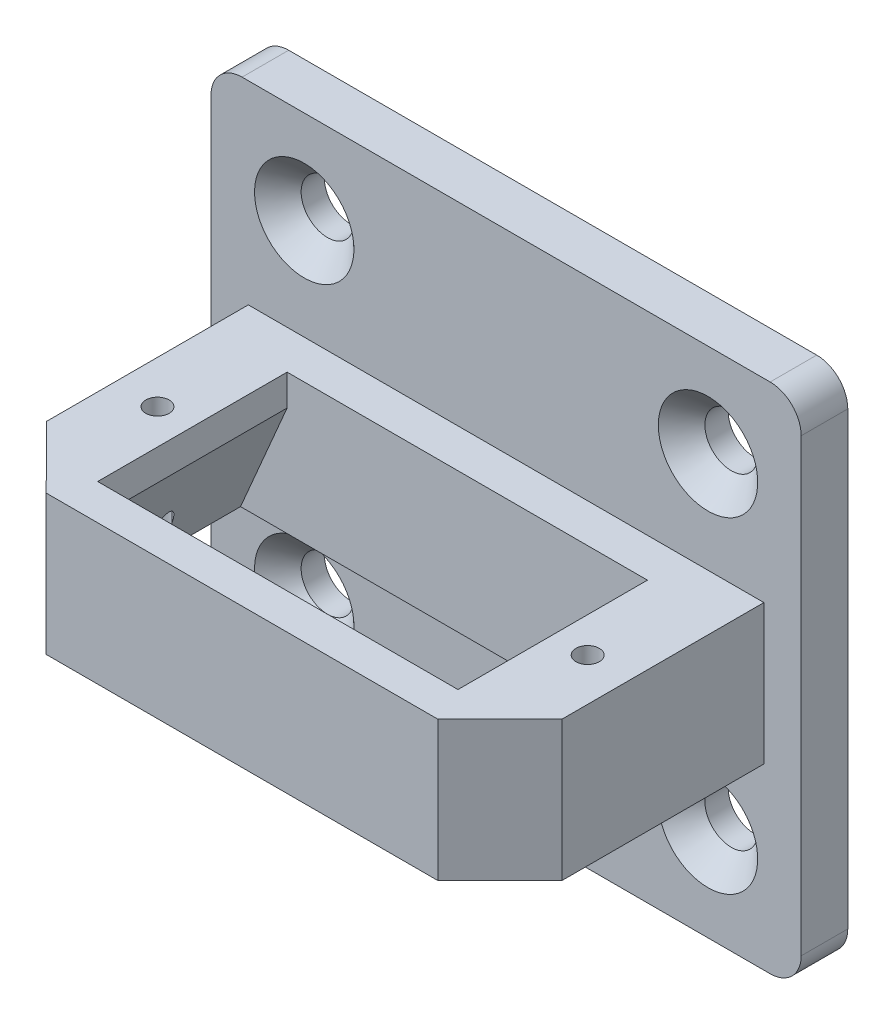
ISO-10303-21;
HEADER;
FILE_DESCRIPTION(('STEP AP214'),'2;1');
FILE_NAME('part.step','',(''),(''),'','','');
FILE_SCHEMA(('AUTOMOTIVE_DESIGN { 1 0 10303 214 1 1 1 1 }'));
ENDSEC;
DATA;
#1=APPLICATION_CONTEXT('core data for automotive mechanical design processes');
#2=APPLICATION_PROTOCOL_DEFINITION('international standard','automotive_design',2000,#1);
#3=PRODUCT_CONTEXT('',#1,'mechanical');
#4=PRODUCT('Part','Part','',(#3));
#5=PRODUCT_RELATED_PRODUCT_CATEGORY('part','',(#4));
#6=PRODUCT_DEFINITION_FORMATION('','',#4);
#7=PRODUCT_DEFINITION_CONTEXT('part definition',#1,'design');
#8=PRODUCT_DEFINITION('design','',#6,#7);
#9=PRODUCT_DEFINITION_SHAPE('','',#8);
#10=(LENGTH_UNIT() NAMED_UNIT(*) SI_UNIT(.MILLI.,.METRE.));
#11=(NAMED_UNIT(*) PLANE_ANGLE_UNIT() SI_UNIT($,.RADIAN.));
#12=(NAMED_UNIT(*) SI_UNIT($,.STERADIAN.) SOLID_ANGLE_UNIT());
#13=UNCERTAINTY_MEASURE_WITH_UNIT(LENGTH_MEASURE(1.E-05),#10,'distance_accuracy_value','');
#14=(GEOMETRIC_REPRESENTATION_CONTEXT(3) GLOBAL_UNCERTAINTY_ASSIGNED_CONTEXT((#13)) GLOBAL_UNIT_ASSIGNED_CONTEXT((#10,
#11,#12)) REPRESENTATION_CONTEXT('',''));
#15=CARTESIAN_POINT('',(0.,0.,0.));
#16=DIRECTION('',(0.,0.,1.));
#17=DIRECTION('',(1.,0.,0.));
#18=AXIS2_PLACEMENT_3D('',#15,#16,#17);
#19=CARTESIAN_POINT('',(0.,0.,3.));
#20=DIRECTION('',(0.,0.,-1.));
#21=DIRECTION('',(-1.,0.,0.));
#22=AXIS2_PLACEMENT_3D('',#19,#20,#21);
#23=PLANE('',#22);
#24=CARTESIAN_POINT('',(-13.,10.5,3.));
#25=DIRECTION('',(0.,0.,-1.));
#26=DIRECTION('',(-1.,0.,0.));
#27=AXIS2_PLACEMENT_3D('',#24,#25,#26);
#28=CIRCLE('',#27,3.20000000000002);
#29=CARTESIAN_POINT('',(-16.2,10.5,3.));
#30=VERTEX_POINT('',#29);
#31=EDGE_CURVE('E422',#30,#30,#28,.T.);
#32=ORIENTED_EDGE('',*,*,#31,.T.);
#33=EDGE_LOOP('',(#32));
#34=FACE_BOUND('',#33,.T.);
#35=CARTESIAN_POINT('',(-13.,-10.5,3.));
#36=DIRECTION('',(0.,0.,-1.));
#37=DIRECTION('',(-1.,0.,0.));
#38=AXIS2_PLACEMENT_3D('',#35,#36,#37);
#39=CIRCLE('',#38,3.20000000000002);
#40=CARTESIAN_POINT('',(-16.2,-10.5,3.));
#41=VERTEX_POINT('',#40);
#42=EDGE_CURVE('E418',#41,#41,#39,.T.);
#43=ORIENTED_EDGE('',*,*,#42,.T.);
#44=EDGE_LOOP('',(#43));
#45=FACE_BOUND('',#44,.T.);
#46=CARTESIAN_POINT('',(13.,-10.5,3.));
#47=DIRECTION('',(0.,0.,-1.));
#48=DIRECTION('',(-1.,0.,0.));
#49=AXIS2_PLACEMENT_3D('',#46,#47,#48);
#50=CIRCLE('',#49,3.20000000000002);
#51=CARTESIAN_POINT('',(9.79999999999998,-10.5,3.));
#52=VERTEX_POINT('',#51);
#53=EDGE_CURVE('E414',#52,#52,#50,.T.);
#54=ORIENTED_EDGE('',*,*,#53,.T.);
#55=EDGE_LOOP('',(#54));
#56=FACE_BOUND('',#55,.T.);
#57=CARTESIAN_POINT('',(13.,10.5,3.));
#58=DIRECTION('',(0.,0.,-1.));
#59=DIRECTION('',(-1.,0.,0.));
#60=AXIS2_PLACEMENT_3D('',#57,#58,#59);
#61=CIRCLE('',#60,3.20000000000002);
#62=CARTESIAN_POINT('',(9.79999999999999,10.5,3.));
#63=VERTEX_POINT('',#62);
#64=EDGE_CURVE('E410',#63,#63,#61,.T.);
#65=ORIENTED_EDGE('',*,*,#64,.T.);
#66=EDGE_LOOP('',(#65));
#67=FACE_BOUND('',#66,.T.);
#68=DIRECTION('',(1.,0.,0.));
#69=VECTOR('',#68,1.);
#70=CARTESIAN_POINT('',(-16.6,4.,3.));
#71=LINE('',#70,#69);
#72=CARTESIAN_POINT('',(-16.6,4.,3.));
#73=VERTEX_POINT('',#72);
#74=CARTESIAN_POINT('',(16.6,4.,3.));
#75=VERTEX_POINT('',#74);
#76=EDGE_CURVE('E259',#73,#75,#71,.T.);
#77=ORIENTED_EDGE('',*,*,#76,.T.);
#78=DIRECTION('',(0.,-1.,0.));
#79=VECTOR('',#78,1.);
#80=CARTESIAN_POINT('',(16.6,4.,3.));
#81=LINE('',#80,#79);
#82=CARTESIAN_POINT('',(16.6,-5.,3.));
#83=VERTEX_POINT('',#82);
#84=EDGE_CURVE('E287',#75,#83,#81,.T.);
#85=ORIENTED_EDGE('',*,*,#84,.T.);
#86=DIRECTION('',(1.,0.,0.));
#87=VECTOR('',#86,1.);
#88=CARTESIAN_POINT('',(-16.6,-5.,3.));
#89=LINE('',#88,#87);
#90=CARTESIAN_POINT('',(-16.6,-5.,3.));
#91=VERTEX_POINT('',#90);
#92=EDGE_CURVE('E207',#91,#83,#89,.T.);
#93=ORIENTED_EDGE('',*,*,#92,.F.);
#94=DIRECTION('',(0.,-1.,0.));
#95=VECTOR('',#94,1.);
#96=CARTESIAN_POINT('',(-16.6,4.,3.));
#97=LINE('',#96,#95);
#98=EDGE_CURVE('E288',#73,#91,#97,.T.);
#99=ORIENTED_EDGE('',*,*,#98,.F.);
#100=EDGE_LOOP('',(#77,#85,#93,#99));
#101=FACE_BOUND('',#100,.T.);
#102=DIRECTION('',(-1.,0.,0.));
#103=VECTOR('',#102,1.);
#104=CARTESIAN_POINT('',(-19.,16.5,3.));
#105=LINE('',#104,#103);
#106=CARTESIAN_POINT('',(17.,16.5,3.));
#107=VERTEX_POINT('',#106);
#108=CARTESIAN_POINT('',(-17.,16.5,3.));
#109=VERTEX_POINT('',#108);
#110=EDGE_CURVE('E327',#107,#109,#105,.T.);
#111=ORIENTED_EDGE('',*,*,#110,.T.);
#112=CARTESIAN_POINT('',(-17.,14.5,3.));
#113=DIRECTION('',(0.,0.,-1.));
#114=DIRECTION('',(-1.,0.,0.));
#115=AXIS2_PLACEMENT_3D('',#112,#113,#114);
#116=CIRCLE('',#115,2.);
#117=CARTESIAN_POINT('',(-19.,14.5,3.));
#118=VERTEX_POINT('',#117);
#119=EDGE_CURVE('E389',#109,#118,#116,.F.);
#120=ORIENTED_EDGE('',*,*,#119,.T.);
#121=DIRECTION('',(0.,-1.,0.));
#122=VECTOR('',#121,1.);
#123=CARTESIAN_POINT('',(-19.,-16.5,3.));
#124=LINE('',#123,#122);
#125=CARTESIAN_POINT('',(-19.,-14.5,3.));
#126=VERTEX_POINT('',#125);
#127=EDGE_CURVE('E332',#118,#126,#124,.T.);
#128=ORIENTED_EDGE('',*,*,#127,.T.);
#129=CARTESIAN_POINT('',(-17.,-14.5,3.));
#130=DIRECTION('',(0.,0.,-1.));
#131=DIRECTION('',(-1.,0.,0.));
#132=AXIS2_PLACEMENT_3D('',#129,#130,#131);
#133=CIRCLE('',#132,2.);
#134=CARTESIAN_POINT('',(-17.,-16.5,3.));
#135=VERTEX_POINT('',#134);
#136=EDGE_CURVE('E386',#126,#135,#133,.F.);
#137=ORIENTED_EDGE('',*,*,#136,.T.);
#138=DIRECTION('',(1.,0.,0.));
#139=VECTOR('',#138,1.);
#140=CARTESIAN_POINT('',(-19.,-16.5,3.));
#141=LINE('',#140,#139);
#142=CARTESIAN_POINT('',(17.,-16.5,3.));
#143=VERTEX_POINT('',#142);
#144=EDGE_CURVE('E336',#135,#143,#141,.T.);
#145=ORIENTED_EDGE('',*,*,#144,.T.);
#146=CARTESIAN_POINT('',(17.,-14.5,3.));
#147=DIRECTION('',(0.,0.,-1.));
#148=DIRECTION('',(-1.,0.,0.));
#149=AXIS2_PLACEMENT_3D('',#146,#147,#148);
#150=CIRCLE('',#149,2.);
#151=CARTESIAN_POINT('',(19.,-14.5,3.));
#152=VERTEX_POINT('',#151);
#153=EDGE_CURVE('E380',#143,#152,#150,.F.);
#154=ORIENTED_EDGE('',*,*,#153,.T.);
#155=DIRECTION('',(0.,1.,0.));
#156=VECTOR('',#155,1.);
#157=CARTESIAN_POINT('',(19.,-16.5,3.));
#158=LINE('',#157,#156);
#159=CARTESIAN_POINT('',(19.,14.5,3.));
#160=VERTEX_POINT('',#159);
#161=EDGE_CURVE('E323',#152,#160,#158,.T.);
#162=ORIENTED_EDGE('',*,*,#161,.T.);
#163=CARTESIAN_POINT('',(17.,14.5,3.));
#164=DIRECTION('',(0.,0.,-1.));
#165=DIRECTION('',(-1.,0.,0.));
#166=AXIS2_PLACEMENT_3D('',#163,#164,#165);
#167=CIRCLE('',#166,2.);
#168=EDGE_CURVE('E383',#160,#107,#167,.F.);
#169=ORIENTED_EDGE('',*,*,#168,.T.);
#170=EDGE_LOOP('',(#111,#120,#128,#137,#145,#154,#162,#169));
#171=FACE_BOUND('',#170,.T.);
#172=ADVANCED_FACE('F45',(#34,#45,#56,#67,#101,#171),#23,.F.);
#173=CARTESIAN_POINT('',(0.,0.,0.));
#174=DIRECTION('',(0.,0.,-1.));
#175=DIRECTION('',(-1.,0.,0.));
#176=AXIS2_PLACEMENT_3D('',#173,#174,#175);
#177=PLANE('',#176);
#178=CARTESIAN_POINT('',(13.,-10.5,0.));
#179=DIRECTION('',(0.,0.,1.));
#180=DIRECTION('',(1.,0.,0.));
#181=AXIS2_PLACEMENT_3D('',#178,#179,#180);
#182=CIRCLE('',#181,1.7);
#183=CARTESIAN_POINT('',(14.7,-10.5,0.));
#184=VERTEX_POINT('',#183);
#185=EDGE_CURVE('E310',#184,#184,#182,.T.);
#186=ORIENTED_EDGE('',*,*,#185,.T.);
#187=EDGE_LOOP('',(#186));
#188=FACE_BOUND('',#187,.T.);
#189=CARTESIAN_POINT('',(-13.,10.5,0.));
#190=DIRECTION('',(0.,0.,1.));
#191=DIRECTION('',(1.,0.,0.));
#192=AXIS2_PLACEMENT_3D('',#189,#190,#191);
#193=CIRCLE('',#192,1.7);
#194=CARTESIAN_POINT('',(-11.3,10.5,0.));
#195=VERTEX_POINT('',#194);
#196=EDGE_CURVE('E318',#195,#195,#193,.T.);
#197=ORIENTED_EDGE('',*,*,#196,.T.);
#198=EDGE_LOOP('',(#197));
#199=FACE_BOUND('',#198,.T.);
#200=DIRECTION('',(0.,-1.,0.));
#201=VECTOR('',#200,1.);
#202=CARTESIAN_POINT('',(-19.,-16.5,0.));
#203=LINE('',#202,#201);
#204=CARTESIAN_POINT('',(-19.,14.5,0.));
#205=VERTEX_POINT('',#204);
#206=CARTESIAN_POINT('',(-19.,-14.5,0.));
#207=VERTEX_POINT('',#206);
#208=EDGE_CURVE('E348',#205,#207,#203,.T.);
#209=ORIENTED_EDGE('',*,*,#208,.F.);
#210=CARTESIAN_POINT('',(-17.,14.5,0.));
#211=DIRECTION('',(0.,0.,-1.));
#212=DIRECTION('',(-1.,0.,0.));
#213=AXIS2_PLACEMENT_3D('',#210,#211,#212);
#214=CIRCLE('',#213,2.);
#215=CARTESIAN_POINT('',(-17.,16.5,0.));
#216=VERTEX_POINT('',#215);
#217=EDGE_CURVE('E370',#205,#216,#214,.T.);
#218=ORIENTED_EDGE('',*,*,#217,.T.);
#219=DIRECTION('',(-1.,0.,0.));
#220=VECTOR('',#219,1.);
#221=CARTESIAN_POINT('',(-19.,16.5,0.));
#222=LINE('',#221,#220);
#223=CARTESIAN_POINT('',(17.,16.5,0.));
#224=VERTEX_POINT('',#223);
#225=EDGE_CURVE('E344',#224,#216,#222,.T.);
#226=ORIENTED_EDGE('',*,*,#225,.F.);
#227=CARTESIAN_POINT('',(17.,14.5,0.));
#228=DIRECTION('',(0.,0.,-1.));
#229=DIRECTION('',(-1.,0.,0.));
#230=AXIS2_PLACEMENT_3D('',#227,#228,#229);
#231=CIRCLE('',#230,2.);
#232=CARTESIAN_POINT('',(19.,14.5,0.));
#233=VERTEX_POINT('',#232);
#234=EDGE_CURVE('E364',#224,#233,#231,.T.);
#235=ORIENTED_EDGE('',*,*,#234,.T.);
#236=DIRECTION('',(0.,1.,0.));
#237=VECTOR('',#236,1.);
#238=CARTESIAN_POINT('',(19.,-16.5,0.));
#239=LINE('',#238,#237);
#240=CARTESIAN_POINT('',(19.,-14.5,0.));
#241=VERTEX_POINT('',#240);
#242=EDGE_CURVE('E322',#241,#233,#239,.T.);
#243=ORIENTED_EDGE('',*,*,#242,.F.);
#244=CARTESIAN_POINT('',(17.,-14.5,0.));
#245=DIRECTION('',(0.,0.,-1.));
#246=DIRECTION('',(-1.,0.,0.));
#247=AXIS2_PLACEMENT_3D('',#244,#245,#246);
#248=CIRCLE('',#247,2.);
#249=CARTESIAN_POINT('',(17.,-16.5,0.));
#250=VERTEX_POINT('',#249);
#251=EDGE_CURVE('E361',#241,#250,#248,.T.);
#252=ORIENTED_EDGE('',*,*,#251,.T.);
#253=DIRECTION('',(1.,0.,0.));
#254=VECTOR('',#253,1.);
#255=CARTESIAN_POINT('',(-19.,-16.5,0.));
#256=LINE('',#255,#254);
#257=CARTESIAN_POINT('',(-17.,-16.5,0.));
#258=VERTEX_POINT('',#257);
#259=EDGE_CURVE('E328',#258,#250,#256,.T.);
#260=ORIENTED_EDGE('',*,*,#259,.F.);
#261=CARTESIAN_POINT('',(-17.,-14.5,0.));
#262=DIRECTION('',(0.,0.,-1.));
#263=DIRECTION('',(-1.,0.,0.));
#264=AXIS2_PLACEMENT_3D('',#261,#262,#263);
#265=CIRCLE('',#264,2.);
#266=EDGE_CURVE('E367',#258,#207,#265,.T.);
#267=ORIENTED_EDGE('',*,*,#266,.T.);
#268=EDGE_LOOP('',(#209,#218,#226,#235,#243,#252,#260,#267));
#269=FACE_BOUND('',#268,.T.);
#270=CARTESIAN_POINT('',(13.,10.5,0.));
#271=DIRECTION('',(0.,0.,1.));
#272=DIRECTION('',(1.,0.,0.));
#273=AXIS2_PLACEMENT_3D('',#270,#271,#272);
#274=CIRCLE('',#273,1.7);
#275=CARTESIAN_POINT('',(14.7,10.5,0.));
#276=VERTEX_POINT('',#275);
#277=EDGE_CURVE('E314',#276,#276,#274,.T.);
#278=ORIENTED_EDGE('',*,*,#277,.T.);
#279=EDGE_LOOP('',(#278));
#280=FACE_BOUND('',#279,.T.);
#281=CARTESIAN_POINT('',(-13.,-10.5,0.));
#282=DIRECTION('',(0.,0.,1.));
#283=DIRECTION('',(1.,0.,0.));
#284=AXIS2_PLACEMENT_3D('',#281,#282,#283);
#285=CIRCLE('',#284,1.7);
#286=CARTESIAN_POINT('',(-11.3,-10.5,0.));
#287=VERTEX_POINT('',#286);
#288=EDGE_CURVE('E291',#287,#287,#285,.T.);
#289=ORIENTED_EDGE('',*,*,#288,.T.);
#290=EDGE_LOOP('',(#289));
#291=FACE_BOUND('',#290,.T.);
#292=ADVANCED_FACE('F495',(#188,#199,#269,#280,#291),#177,.T.);
#293=CARTESIAN_POINT('',(19.,-16.5,3.));
#294=DIRECTION('',(-1.,0.,0.));
#295=DIRECTION('',(0.,0.,1.));
#296=AXIS2_PLACEMENT_3D('',#293,#294,#295);
#297=PLANE('',#296);
#298=ORIENTED_EDGE('',*,*,#242,.T.);
#299=DIRECTION('',(0.,0.,-1.));
#300=VECTOR('',#299,1.);
#301=CARTESIAN_POINT('',(19.,14.5,3.));
#302=LINE('',#301,#300);
#303=EDGE_CURVE('E403',#233,#160,#302,.F.);
#304=ORIENTED_EDGE('',*,*,#303,.T.);
#305=ORIENTED_EDGE('',*,*,#161,.F.);
#306=DIRECTION('',(0.,0.,-1.));
#307=VECTOR('',#306,1.);
#308=CARTESIAN_POINT('',(19.,-14.5,3.));
#309=LINE('',#308,#307);
#310=EDGE_CURVE('E399',#152,#241,#309,.T.);
#311=ORIENTED_EDGE('',*,*,#310,.T.);
#312=EDGE_LOOP('',(#298,#304,#305,#311));
#313=FACE_BOUND('',#312,.T.);
#314=ADVANCED_FACE('F501',(#313),#297,.F.);
#315=CARTESIAN_POINT('',(-19.,16.5,3.));
#316=DIRECTION('',(0.,-1.,0.));
#317=DIRECTION('',(0.,0.,-1.));
#318=AXIS2_PLACEMENT_3D('',#315,#316,#317);
#319=PLANE('',#318);
#320=ORIENTED_EDGE('',*,*,#225,.T.);
#321=DIRECTION('',(0.,0.,-1.));
#322=VECTOR('',#321,1.);
#323=CARTESIAN_POINT('',(-17.,16.5,3.));
#324=LINE('',#323,#322);
#325=EDGE_CURVE('E377',#216,#109,#324,.F.);
#326=ORIENTED_EDGE('',*,*,#325,.T.);
#327=ORIENTED_EDGE('',*,*,#110,.F.);
#328=DIRECTION('',(0.,0.,-1.));
#329=VECTOR('',#328,1.);
#330=CARTESIAN_POINT('',(17.,16.5,3.));
#331=LINE('',#330,#329);
#332=EDGE_CURVE('E373',#107,#224,#331,.T.);
#333=ORIENTED_EDGE('',*,*,#332,.T.);
#334=EDGE_LOOP('',(#320,#326,#327,#333));
#335=FACE_BOUND('',#334,.T.);
#336=ADVANCED_FACE('F516',(#335),#319,.F.);
#337=CARTESIAN_POINT('',(-19.,-16.5,3.));
#338=DIRECTION('',(1.,0.,0.));
#339=DIRECTION('',(0.,0.,-1.));
#340=AXIS2_PLACEMENT_3D('',#337,#338,#339);
#341=PLANE('',#340);
#342=ORIENTED_EDGE('',*,*,#127,.F.);
#343=DIRECTION('',(0.,0.,-1.));
#344=VECTOR('',#343,1.);
#345=CARTESIAN_POINT('',(-19.,14.5,3.));
#346=LINE('',#345,#344);
#347=EDGE_CURVE('E357',#118,#205,#346,.T.);
#348=ORIENTED_EDGE('',*,*,#347,.T.);
#349=ORIENTED_EDGE('',*,*,#208,.T.);
#350=DIRECTION('',(0.,0.,-1.));
#351=VECTOR('',#350,1.);
#352=CARTESIAN_POINT('',(-19.,-14.5,3.));
#353=LINE('',#352,#351);
#354=EDGE_CURVE('E340',#207,#126,#353,.F.);
#355=ORIENTED_EDGE('',*,*,#354,.T.);
#356=EDGE_LOOP('',(#342,#348,#349,#355));
#357=FACE_BOUND('',#356,.T.);
#358=ADVANCED_FACE('F512',(#357),#341,.F.);
#359=CARTESIAN_POINT('',(-19.,-16.5,3.));
#360=DIRECTION('',(0.,1.,0.));
#361=DIRECTION('',(0.,0.,1.));
#362=AXIS2_PLACEMENT_3D('',#359,#360,#361);
#363=PLANE('',#362);
#364=ORIENTED_EDGE('',*,*,#144,.F.);
#365=DIRECTION('',(0.,0.,-1.));
#366=VECTOR('',#365,1.);
#367=CARTESIAN_POINT('',(-17.,-16.5,3.));
#368=LINE('',#367,#366);
#369=EDGE_CURVE('E395',#135,#258,#368,.T.);
#370=ORIENTED_EDGE('',*,*,#369,.T.);
#371=ORIENTED_EDGE('',*,*,#259,.T.);
#372=DIRECTION('',(0.,0.,-1.));
#373=VECTOR('',#372,1.);
#374=CARTESIAN_POINT('',(17.,-16.5,3.));
#375=LINE('',#374,#373);
#376=EDGE_CURVE('E392',#250,#143,#375,.F.);
#377=ORIENTED_EDGE('',*,*,#376,.T.);
#378=EDGE_LOOP('',(#364,#370,#371,#377));
#379=FACE_BOUND('',#378,.T.);
#380=ADVANCED_FACE('F509',(#379),#363,.F.);
#381=CARTESIAN_POINT('',(-13.,10.5,3.));
#382=DIRECTION('',(0.,0.,-1.));
#383=DIRECTION('',(-1.,0.,0.));
#384=AXIS2_PLACEMENT_3D('',#381,#382,#383);
#385=CYLINDRICAL_SURFACE('',#384,1.7);
#386=CARTESIAN_POINT('',(-13.,10.5,1.49999999999999));
#387=DIRECTION('',(0.,0.,-1.));
#388=DIRECTION('',(-1.,0.,0.));
#389=AXIS2_PLACEMENT_3D('',#386,#387,#388);
#390=CIRCLE('',#389,1.7);
#391=CARTESIAN_POINT('',(-14.7,10.5,1.49999999999999));
#392=VERTEX_POINT('',#391);
#393=EDGE_CURVE('E406',#392,#392,#390,.F.);
#394=ORIENTED_EDGE('',*,*,#393,.T.);
#395=EDGE_LOOP('',(#394));
#396=FACE_BOUND('',#395,.T.);
#397=ORIENTED_EDGE('',*,*,#196,.F.);
#398=EDGE_LOOP('',(#397));
#399=FACE_BOUND('',#398,.T.);
#400=ADVANCED_FACE('F506',(#396,#399),#385,.F.);
#401=CARTESIAN_POINT('',(13.,10.5,3.));
#402=DIRECTION('',(0.,0.,-1.));
#403=DIRECTION('',(-1.,0.,0.));
#404=AXIS2_PLACEMENT_3D('',#401,#402,#403);
#405=CYLINDRICAL_SURFACE('',#404,1.7);
#406=CARTESIAN_POINT('',(13.,10.5,1.49999999999999));
#407=DIRECTION('',(0.,0.,-1.));
#408=DIRECTION('',(-1.,0.,0.));
#409=AXIS2_PLACEMENT_3D('',#406,#407,#408);
#410=CIRCLE('',#409,1.7);
#411=CARTESIAN_POINT('',(11.3,10.5,1.49999999999999));
#412=VERTEX_POINT('',#411);
#413=EDGE_CURVE('E434',#412,#412,#410,.F.);
#414=ORIENTED_EDGE('',*,*,#413,.T.);
#415=EDGE_LOOP('',(#414));
#416=FACE_BOUND('',#415,.T.);
#417=ORIENTED_EDGE('',*,*,#277,.F.);
#418=EDGE_LOOP('',(#417));
#419=FACE_BOUND('',#418,.T.);
#420=ADVANCED_FACE('F573',(#416,#419),#405,.F.);
#421=CARTESIAN_POINT('',(13.,-10.5,3.));
#422=DIRECTION('',(0.,0.,-1.));
#423=DIRECTION('',(-1.,0.,0.));
#424=AXIS2_PLACEMENT_3D('',#421,#422,#423);
#425=CYLINDRICAL_SURFACE('',#424,1.7);
#426=CARTESIAN_POINT('',(13.,-10.5,1.49999999999999));
#427=DIRECTION('',(0.,0.,-1.));
#428=DIRECTION('',(-1.,0.,0.));
#429=AXIS2_PLACEMENT_3D('',#426,#427,#428);
#430=CIRCLE('',#429,1.7);
#431=CARTESIAN_POINT('',(11.3,-10.5,1.49999999999999));
#432=VERTEX_POINT('',#431);
#433=EDGE_CURVE('E430',#432,#432,#430,.F.);
#434=ORIENTED_EDGE('',*,*,#433,.T.);
#435=EDGE_LOOP('',(#434));
#436=FACE_BOUND('',#435,.T.);
#437=ORIENTED_EDGE('',*,*,#185,.F.);
#438=EDGE_LOOP('',(#437));
#439=FACE_BOUND('',#438,.T.);
#440=ADVANCED_FACE('F576',(#436,#439),#425,.F.);
#441=CARTESIAN_POINT('',(-13.,-10.5,3.));
#442=DIRECTION('',(0.,0.,-1.));
#443=DIRECTION('',(-1.,0.,0.));
#444=AXIS2_PLACEMENT_3D('',#441,#442,#443);
#445=CYLINDRICAL_SURFACE('',#444,1.7);
#446=CARTESIAN_POINT('',(-13.,-10.5,1.49999999999999));
#447=DIRECTION('',(0.,0.,-1.));
#448=DIRECTION('',(-1.,0.,0.));
#449=AXIS2_PLACEMENT_3D('',#446,#447,#448);
#450=CIRCLE('',#449,1.7);
#451=CARTESIAN_POINT('',(-14.7,-10.5,1.49999999999999));
#452=VERTEX_POINT('',#451);
#453=EDGE_CURVE('E426',#452,#452,#450,.F.);
#454=ORIENTED_EDGE('',*,*,#453,.T.);
#455=EDGE_LOOP('',(#454));
#456=FACE_BOUND('',#455,.T.);
#457=ORIENTED_EDGE('',*,*,#288,.F.);
#458=EDGE_LOOP('',(#457));
#459=FACE_BOUND('',#458,.T.);
#460=ADVANCED_FACE('F582',(#456,#459),#445,.F.);
#461=CARTESIAN_POINT('',(-16.6,4.,3.));
#462=DIRECTION('',(-1.,0.,0.));
#463=DIRECTION('',(0.,0.,1.));
#464=AXIS2_PLACEMENT_3D('',#461,#462,#463);
#465=PLANE('',#464);
#466=ORIENTED_EDGE('',*,*,#98,.T.);
#467=DIRECTION('',(0.,0.,-1.));
#468=VECTOR('',#467,1.);
#469=CARTESIAN_POINT('',(-16.6,-5.,3.));
#470=LINE('',#469,#468);
#471=CARTESIAN_POINT('',(-16.6,-5.,16.));
#472=VERTEX_POINT('',#471);
#473=EDGE_CURVE('E230',#472,#91,#470,.T.);
#474=ORIENTED_EDGE('',*,*,#473,.F.);
#475=DIRECTION('',(0.,-1.,0.));
#476=VECTOR('',#475,1.);
#477=CARTESIAN_POINT('',(-16.6,4.,16.));
#478=LINE('',#477,#476);
#479=CARTESIAN_POINT('',(-16.6,4.,16.));
#480=VERTEX_POINT('',#479);
#481=EDGE_CURVE('E292',#480,#472,#478,.T.);
#482=ORIENTED_EDGE('',*,*,#481,.F.);
#483=DIRECTION('',(0.,0.,-1.));
#484=VECTOR('',#483,1.);
#485=CARTESIAN_POINT('',(-16.6,4.,3.));
#486=LINE('',#485,#484);
#487=EDGE_CURVE('E283',#480,#73,#486,.T.);
#488=ORIENTED_EDGE('',*,*,#487,.T.);
#489=EDGE_LOOP('',(#466,#474,#482,#488));
#490=FACE_BOUND('',#489,.T.);
#491=ADVANCED_FACE('F471',(#490),#465,.T.);
#492=CARTESIAN_POINT('',(-16.6,4.,16.));
#493=DIRECTION('',(-0.708239573751038,0.,0.705972170962105));
#494=DIRECTION('',(0.705972170962105,0.,0.708239573751038));
#495=AXIS2_PLACEMENT_3D('',#492,#493,#494);
#496=PLANE('',#495);
#497=ORIENTED_EDGE('',*,*,#481,.T.);
#498=DIRECTION('',(-0.705972170962105,0.,-0.708239573751038));
#499=VECTOR('',#498,1.);
#500=CARTESIAN_POINT('',(-16.6,-5.,16.));
#501=LINE('',#500,#499);
#502=CARTESIAN_POINT('',(-12.6128058519911,-5.,20.));
#503=VERTEX_POINT('',#502);
#504=EDGE_CURVE('E226',#503,#472,#501,.T.);
#505=ORIENTED_EDGE('',*,*,#504,.F.);
#506=DIRECTION('',(0.,-1.,0.));
#507=VECTOR('',#506,1.);
#508=CARTESIAN_POINT('',(-12.6128058519911,4.,20.));
#509=LINE('',#508,#507);
#510=CARTESIAN_POINT('',(-12.6128058519911,4.,20.));
#511=VERTEX_POINT('',#510);
#512=EDGE_CURVE('E295',#511,#503,#509,.T.);
#513=ORIENTED_EDGE('',*,*,#512,.F.);
#514=DIRECTION('',(-0.705972170962105,0.,-0.708239573751038));
#515=VECTOR('',#514,1.);
#516=CARTESIAN_POINT('',(-16.6,4.,16.));
#517=LINE('',#516,#515);
#518=EDGE_CURVE('E279',#511,#480,#517,.T.);
#519=ORIENTED_EDGE('',*,*,#518,.T.);
#520=EDGE_LOOP('',(#497,#505,#513,#519));
#521=FACE_BOUND('',#520,.T.);
#522=ADVANCED_FACE('F480',(#521),#496,.T.);
#523=CARTESIAN_POINT('',(-12.6128058519911,4.,20.));
#524=DIRECTION('',(0.,0.,1.));
#525=DIRECTION('',(1.,0.,0.));
#526=AXIS2_PLACEMENT_3D('',#523,#524,#525);
#527=PLANE('',#526);
#528=ORIENTED_EDGE('',*,*,#512,.T.);
#529=DIRECTION('',(-1.,0.,0.));
#530=VECTOR('',#529,1.);
#531=CARTESIAN_POINT('',(-12.6128058519911,-5.,20.));
#532=LINE('',#531,#530);
#533=CARTESIAN_POINT('',(12.6128058519911,-5.,20.));
#534=VERTEX_POINT('',#533);
#535=EDGE_CURVE('E222',#534,#503,#532,.T.);
#536=ORIENTED_EDGE('',*,*,#535,.F.);
#537=DIRECTION('',(0.,-1.,0.));
#538=VECTOR('',#537,1.);
#539=CARTESIAN_POINT('',(12.6128058519911,4.,20.));
#540=LINE('',#539,#538);
#541=CARTESIAN_POINT('',(12.6128058519911,4.,20.));
#542=VERTEX_POINT('',#541);
#543=EDGE_CURVE('E298',#542,#534,#540,.T.);
#544=ORIENTED_EDGE('',*,*,#543,.F.);
#545=DIRECTION('',(-1.,0.,0.));
#546=VECTOR('',#545,1.);
#547=CARTESIAN_POINT('',(-12.6128058519911,4.,20.));
#548=LINE('',#547,#546);
#549=EDGE_CURVE('E275',#542,#511,#548,.T.);
#550=ORIENTED_EDGE('',*,*,#549,.T.);
#551=EDGE_LOOP('',(#528,#536,#544,#550));
#552=FACE_BOUND('',#551,.T.);
#553=ADVANCED_FACE('F483',(#552),#527,.T.);
#554=CARTESIAN_POINT('',(12.6128058519911,4.,20.));
#555=DIRECTION('',(0.708239573751038,0.,0.705972170962106));
#556=DIRECTION('',(0.705972170962106,0.,-0.708239573751038));
#557=AXIS2_PLACEMENT_3D('',#554,#555,#556);
#558=PLANE('',#557);
#559=ORIENTED_EDGE('',*,*,#543,.T.);
#560=DIRECTION('',(-0.705972170962106,0.,0.708239573751038));
#561=VECTOR('',#560,1.);
#562=CARTESIAN_POINT('',(12.6128058519911,-5.,20.));
#563=LINE('',#562,#561);
#564=CARTESIAN_POINT('',(16.6,-5.,16.));
#565=VERTEX_POINT('',#564);
#566=EDGE_CURVE('E218',#565,#534,#563,.T.);
#567=ORIENTED_EDGE('',*,*,#566,.F.);
#568=DIRECTION('',(0.,-1.,0.));
#569=VECTOR('',#568,1.);
#570=CARTESIAN_POINT('',(16.6,4.,16.));
#571=LINE('',#570,#569);
#572=CARTESIAN_POINT('',(16.6,4.,16.));
#573=VERTEX_POINT('',#572);
#574=EDGE_CURVE('E301',#573,#565,#571,.T.);
#575=ORIENTED_EDGE('',*,*,#574,.F.);
#576=DIRECTION('',(-0.705972170962106,0.,0.708239573751038));
#577=VECTOR('',#576,1.);
#578=CARTESIAN_POINT('',(12.6128058519911,4.,20.));
#579=LINE('',#578,#577);
#580=EDGE_CURVE('E271',#573,#542,#579,.T.);
#581=ORIENTED_EDGE('',*,*,#580,.T.);
#582=EDGE_LOOP('',(#559,#567,#575,#581));
#583=FACE_BOUND('',#582,.T.);
#584=ADVANCED_FACE('F485',(#583),#558,.T.);
#585=CARTESIAN_POINT('',(16.6,4.,3.));
#586=DIRECTION('',(1.,0.,0.));
#587=DIRECTION('',(0.,0.,-1.));
#588=AXIS2_PLACEMENT_3D('',#585,#586,#587);
#589=PLANE('',#588);
#590=ORIENTED_EDGE('',*,*,#574,.T.);
#591=DIRECTION('',(0.,0.,1.));
#592=VECTOR('',#591,1.);
#593=CARTESIAN_POINT('',(16.6,-5.,3.));
#594=LINE('',#593,#592);
#595=EDGE_CURVE('E214',#83,#565,#594,.T.);
#596=ORIENTED_EDGE('',*,*,#595,.F.);
#597=ORIENTED_EDGE('',*,*,#84,.F.);
#598=DIRECTION('',(0.,0.,1.));
#599=VECTOR('',#598,1.);
#600=CARTESIAN_POINT('',(16.6,4.,3.));
#601=LINE('',#600,#599);
#602=EDGE_CURVE('E267',#75,#573,#601,.T.);
#603=ORIENTED_EDGE('',*,*,#602,.T.);
#604=EDGE_LOOP('',(#590,#596,#597,#603));
#605=FACE_BOUND('',#604,.T.);
#606=ADVANCED_FACE('F461',(#605),#589,.T.);
#607=CARTESIAN_POINT('',(0.,4.,0.));
#608=DIRECTION('',(0.,-1.,0.));
#609=DIRECTION('',(0.,0.,-1.));
#610=AXIS2_PLACEMENT_3D('',#607,#608,#609);
#611=PLANE('',#610);
#612=CARTESIAN_POINT('',(-13.85,4.,11.6));
#613=DIRECTION('',(0.,-1.,0.));
#614=DIRECTION('',(0.,0.,-1.));
#615=AXIS2_PLACEMENT_3D('',#612,#613,#614);
#616=CIRCLE('',#615,0.75);
#617=CARTESIAN_POINT('',(-13.85,4.,10.85));
#618=VERTEX_POINT('',#617);
#619=EDGE_CURVE('E234',#618,#618,#616,.T.);
#620=ORIENTED_EDGE('',*,*,#619,.T.);
#621=EDGE_LOOP('',(#620));
#622=FACE_BOUND('',#621,.T.);
#623=CARTESIAN_POINT('',(13.85,4.,11.6));
#624=DIRECTION('',(0.,-1.,0.));
#625=DIRECTION('',(0.,0.,-1.));
#626=AXIS2_PLACEMENT_3D('',#623,#624,#625);
#627=CIRCLE('',#626,0.75);
#628=CARTESIAN_POINT('',(13.85,4.,10.85));
#629=VERTEX_POINT('',#628);
#630=EDGE_CURVE('E238',#629,#629,#627,.T.);
#631=ORIENTED_EDGE('',*,*,#630,.T.);
#632=EDGE_LOOP('',(#631));
#633=FACE_BOUND('',#632,.T.);
#634=DIRECTION('',(-1.,0.,0.));
#635=VECTOR('',#634,1.);
#636=CARTESIAN_POINT('',(11.6,4.,17.7));
#637=LINE('',#636,#635);
#638=CARTESIAN_POINT('',(11.6,4.,17.7));
#639=VERTEX_POINT('',#638);
#640=CARTESIAN_POINT('',(-11.6,4.,17.7));
#641=VERTEX_POINT('',#640);
#642=EDGE_CURVE('E251',#639,#641,#637,.T.);
#643=ORIENTED_EDGE('',*,*,#642,.T.);
#644=DIRECTION('',(0.,0.,-1.));
#645=VECTOR('',#644,1.);
#646=CARTESIAN_POINT('',(-11.6,4.,17.7));
#647=LINE('',#646,#645);
#648=CARTESIAN_POINT('',(-11.6,4.,5.5));
#649=VERTEX_POINT('',#648);
#650=EDGE_CURVE('E242',#641,#649,#647,.T.);
#651=ORIENTED_EDGE('',*,*,#650,.T.);
#652=DIRECTION('',(1.,0.,0.));
#653=VECTOR('',#652,1.);
#654=CARTESIAN_POINT('',(11.6,4.,5.5));
#655=LINE('',#654,#653);
#656=CARTESIAN_POINT('',(11.6,4.,5.5));
#657=VERTEX_POINT('',#656);
#658=EDGE_CURVE('E246',#649,#657,#655,.T.);
#659=ORIENTED_EDGE('',*,*,#658,.T.);
#660=DIRECTION('',(0.,0.,1.));
#661=VECTOR('',#660,1.);
#662=CARTESIAN_POINT('',(11.6,4.,17.7));
#663=LINE('',#662,#661);
#664=EDGE_CURVE('E188',#657,#639,#663,.T.);
#665=ORIENTED_EDGE('',*,*,#664,.T.);
#666=EDGE_LOOP('',(#643,#651,#659,#665));
#667=FACE_BOUND('',#666,.T.);
#668=ORIENTED_EDGE('',*,*,#76,.F.);
#669=ORIENTED_EDGE('',*,*,#487,.F.);
#670=ORIENTED_EDGE('',*,*,#518,.F.);
#671=ORIENTED_EDGE('',*,*,#549,.F.);
#672=ORIENTED_EDGE('',*,*,#580,.F.);
#673=ORIENTED_EDGE('',*,*,#602,.F.);
#674=EDGE_LOOP('',(#668,#669,#670,#671,#672,#673));
#675=FACE_BOUND('',#674,.T.);
#676=ADVANCED_FACE('F458',(#622,#633,#667,#675),#611,.F.);
#677=CARTESIAN_POINT('',(-11.6,4.,17.7));
#678=DIRECTION('',(-1.,0.,0.));
#679=DIRECTION('',(0.,0.,1.));
#680=AXIS2_PLACEMENT_3D('',#677,#678,#679);
#681=PLANE('',#680);
#682=DIRECTION('',(0.,-1.,0.));
#683=VECTOR('',#682,1.);
#684=CARTESIAN_POINT('',(-11.6,4.,17.7));
#685=LINE('',#684,#683);
#686=CARTESIAN_POINT('',(-11.6,2.00000000000006,17.7));
#687=VERTEX_POINT('',#686);
#688=EDGE_CURVE('E255',#641,#687,#685,.T.);
#689=ORIENTED_EDGE('',*,*,#688,.T.);
#690=DIRECTION('',(0.,0.,-1.));
#691=VECTOR('',#690,1.);
#692=CARTESIAN_POINT('',(-11.6,2.00000000000006,5.5));
#693=LINE('',#692,#691);
#694=CARTESIAN_POINT('',(-11.6,2.00000000000006,5.5));
#695=VERTEX_POINT('',#694);
#696=EDGE_CURVE('E438',#687,#695,#693,.T.);
#697=ORIENTED_EDGE('',*,*,#696,.T.);
#698=DIRECTION('',(0.,-1.,0.));
#699=VECTOR('',#698,1.);
#700=CARTESIAN_POINT('',(-11.6,4.,5.5));
#701=LINE('',#700,#699);
#702=EDGE_CURVE('E194',#649,#695,#701,.T.);
#703=ORIENTED_EDGE('',*,*,#702,.F.);
#704=ORIENTED_EDGE('',*,*,#650,.F.);
#705=EDGE_LOOP('',(#689,#697,#703,#704));
#706=FACE_BOUND('',#705,.T.);
#707=ADVANCED_FACE('F456',(#706),#681,.F.);
#708=CARTESIAN_POINT('',(11.6,4.,17.7));
#709=DIRECTION('',(0.,0.,1.));
#710=DIRECTION('',(1.,0.,0.));
#711=AXIS2_PLACEMENT_3D('',#708,#709,#710);
#712=PLANE('',#711);
#713=DIRECTION('',(0.,-1.,0.));
#714=VECTOR('',#713,1.);
#715=CARTESIAN_POINT('',(11.6,4.,17.7));
#716=LINE('',#715,#714);
#717=CARTESIAN_POINT('',(11.6,-5.,17.7));
#718=VERTEX_POINT('',#717);
#719=EDGE_CURVE('E193',#639,#718,#716,.T.);
#720=ORIENTED_EDGE('',*,*,#719,.T.);
#721=DIRECTION('',(-1.,0.,0.));
#722=VECTOR('',#721,1.);
#723=CARTESIAN_POINT('',(11.6,-5.,17.7));
#724=LINE('',#723,#722);
#725=CARTESIAN_POINT('',(-14.6,-5.,17.7));
#726=VERTEX_POINT('',#725);
#727=EDGE_CURVE('E203',#718,#726,#724,.T.);
#728=ORIENTED_EDGE('',*,*,#727,.T.);
#729=DIRECTION('',(0.393919298579165,0.919145030018059,0.));
#730=VECTOR('',#729,1.);
#731=CARTESIAN_POINT('',(-7.27586206896558,12.0896551724138,17.7));
#732=LINE('',#731,#730);
#733=EDGE_CURVE('E11',#726,#687,#732,.T.);
#734=ORIENTED_EDGE('',*,*,#733,.T.);
#735=ORIENTED_EDGE('',*,*,#688,.F.);
#736=ORIENTED_EDGE('',*,*,#642,.F.);
#737=EDGE_LOOP('',(#720,#728,#734,#735,#736));
#738=FACE_BOUND('',#737,.T.);
#739=ADVANCED_FACE('F452',(#738),#712,.F.);
#740=CARTESIAN_POINT('',(11.6,4.,17.7));
#741=DIRECTION('',(1.,0.,0.));
#742=DIRECTION('',(0.,0.,-1.));
#743=AXIS2_PLACEMENT_3D('',#740,#741,#742);
#744=PLANE('',#743);
#745=DIRECTION('',(0.,-1.,0.));
#746=VECTOR('',#745,1.);
#747=CARTESIAN_POINT('',(11.6,4.,5.5));
#748=LINE('',#747,#746);
#749=CARTESIAN_POINT('',(11.6,-5.,5.5));
#750=VERTEX_POINT('',#749);
#751=EDGE_CURVE('E183',#657,#750,#748,.T.);
#752=ORIENTED_EDGE('',*,*,#751,.T.);
#753=DIRECTION('',(0.,0.,1.));
#754=VECTOR('',#753,1.);
#755=CARTESIAN_POINT('',(11.6,-5.,17.7));
#756=LINE('',#755,#754);
#757=EDGE_CURVE('E185',#750,#718,#756,.T.);
#758=ORIENTED_EDGE('',*,*,#757,.T.);
#759=ORIENTED_EDGE('',*,*,#719,.F.);
#760=ORIENTED_EDGE('',*,*,#664,.F.);
#761=EDGE_LOOP('',(#752,#758,#759,#760));
#762=FACE_BOUND('',#761,.T.);
#763=ADVANCED_FACE('F184',(#762),#744,.F.);
#764=CARTESIAN_POINT('',(11.6,4.,5.5));
#765=DIRECTION('',(0.,0.,-1.));
#766=DIRECTION('',(-1.,0.,0.));
#767=AXIS2_PLACEMENT_3D('',#764,#765,#766);
#768=PLANE('',#767);
#769=ORIENTED_EDGE('',*,*,#702,.T.);
#770=DIRECTION('',(-0.393919298579165,-0.919145030018059,0.));
#771=VECTOR('',#770,1.);
#772=CARTESIAN_POINT('',(-7.27586206896558,12.0896551724138,5.5));
#773=LINE('',#772,#771);
#774=CARTESIAN_POINT('',(-14.6,-5.,5.5));
#775=VERTEX_POINT('',#774);
#776=EDGE_CURVE('E56',#695,#775,#773,.T.);
#777=ORIENTED_EDGE('',*,*,#776,.T.);
#778=DIRECTION('',(1.,0.,0.));
#779=VECTOR('',#778,1.);
#780=CARTESIAN_POINT('',(11.6,-5.,5.5));
#781=LINE('',#780,#779);
#782=EDGE_CURVE('E69',#775,#750,#781,.T.);
#783=ORIENTED_EDGE('',*,*,#782,.T.);
#784=ORIENTED_EDGE('',*,*,#751,.F.);
#785=ORIENTED_EDGE('',*,*,#658,.F.);
#786=EDGE_LOOP('',(#769,#777,#783,#784,#785));
#787=FACE_BOUND('',#786,.T.);
#788=ADVANCED_FACE('F197',(#787),#768,.F.);
#789=CARTESIAN_POINT('',(13.85,4.,11.6));
#790=DIRECTION('',(0.,-1.,0.));
#791=DIRECTION('',(0.,0.,-1.));
#792=AXIS2_PLACEMENT_3D('',#789,#790,#791);
#793=CYLINDRICAL_SURFACE('',#792,0.75);
#794=ORIENTED_EDGE('',*,*,#630,.F.);
#795=EDGE_LOOP('',(#794));
#796=FACE_BOUND('',#795,.T.);
#797=CARTESIAN_POINT('',(13.85,-5.,11.6));
#798=DIRECTION('',(0.,-1.,0.));
#799=DIRECTION('',(0.,0.,-1.));
#800=AXIS2_PLACEMENT_3D('',#797,#798,#799);
#801=CIRCLE('',#800,0.75);
#802=CARTESIAN_POINT('',(13.85,-5.,10.85));
#803=VERTEX_POINT('',#802);
#804=EDGE_CURVE('E199',#803,#803,#801,.T.);
#805=ORIENTED_EDGE('',*,*,#804,.T.);
#806=EDGE_LOOP('',(#805));
#807=FACE_BOUND('',#806,.T.);
#808=ADVANCED_FACE('F705',(#796,#807),#793,.F.);
#809=CARTESIAN_POINT('',(-13.85,4.,11.6));
#810=DIRECTION('',(0.,-1.,0.));
#811=DIRECTION('',(0.,0.,-1.));
#812=AXIS2_PLACEMENT_3D('',#809,#810,#811);
#813=CYLINDRICAL_SURFACE('',#812,0.75);
#814=ORIENTED_EDGE('',*,*,#619,.F.);
#815=EDGE_LOOP('',(#814));
#816=FACE_BOUND('',#815,.T.);
#817=CARTESIAN_POINT('',(-13.85,-3.24999999999997,11.6));
#818=DIRECTION('',(0.919145030018059,-0.393919298579165,0.));
#819=DIRECTION('',(-0.393919298579165,-0.919145030018059,0.));
#820=AXIS2_PLACEMENT_3D('',#817,#818,#819);
#821=ELLIPSE('',#820,1.90394327646599,0.75);
#822=CARTESIAN_POINT('',(-14.6,-5.,11.6));
#823=VERTEX_POINT('',#822);
#824=EDGE_CURVE('E50',#823,#823,#821,.T.);
#825=ORIENTED_EDGE('',*,*,#824,.T.);
#826=EDGE_LOOP('',(#825));
#827=FACE_BOUND('',#826,.T.);
#828=ADVANCED_FACE('F713',(#816,#827),#813,.F.);
#829=CARTESIAN_POINT('',(0.,-5.,0.));
#830=DIRECTION('',(0.,-1.,0.));
#831=DIRECTION('',(0.,0.,-1.));
#832=AXIS2_PLACEMENT_3D('',#829,#830,#831);
#833=PLANE('',#832);
#834=ORIENTED_EDGE('',*,*,#804,.F.);
#835=EDGE_LOOP('',(#834));
#836=FACE_BOUND('',#835,.T.);
#837=ORIENTED_EDGE('',*,*,#92,.T.);
#838=ORIENTED_EDGE('',*,*,#595,.T.);
#839=ORIENTED_EDGE('',*,*,#566,.T.);
#840=ORIENTED_EDGE('',*,*,#535,.T.);
#841=ORIENTED_EDGE('',*,*,#504,.T.);
#842=ORIENTED_EDGE('',*,*,#473,.T.);
#843=EDGE_LOOP('',(#837,#838,#839,#840,#841,#842));
#844=FACE_BOUND('',#843,.T.);
#845=ORIENTED_EDGE('',*,*,#782,.F.);
#846=DIRECTION('',(0.,0.,1.));
#847=VECTOR('',#846,1.);
#848=CARTESIAN_POINT('',(-14.6,-5.,17.7));
#849=LINE('',#848,#847);
#850=EDGE_CURVE('E445',#775,#823,#849,.T.);
#851=ORIENTED_EDGE('',*,*,#850,.T.);
#852=DIRECTION('',(0.,0.,1.));
#853=VECTOR('',#852,1.);
#854=CARTESIAN_POINT('',(-14.6,-5.,17.7));
#855=LINE('',#854,#853);
#856=EDGE_CURVE('E442',#823,#726,#855,.T.);
#857=ORIENTED_EDGE('',*,*,#856,.T.);
#858=ORIENTED_EDGE('',*,*,#727,.F.);
#859=ORIENTED_EDGE('',*,*,#757,.F.);
#860=EDGE_LOOP('',(#845,#851,#857,#858,#859));
#861=FACE_BOUND('',#860,.T.);
#862=ADVANCED_FACE('F201',(#836,#844,#861),#833,.T.);
#863=CARTESIAN_POINT('',(-17.,14.5,3.));
#864=DIRECTION('',(0.,0.,-1.));
#865=DIRECTION('',(-1.,0.,0.));
#866=AXIS2_PLACEMENT_3D('',#863,#864,#865);
#867=CYLINDRICAL_SURFACE('',#866,2.);
#868=ORIENTED_EDGE('',*,*,#119,.F.);
#869=ORIENTED_EDGE('',*,*,#325,.F.);
#870=ORIENTED_EDGE('',*,*,#217,.F.);
#871=ORIENTED_EDGE('',*,*,#347,.F.);
#872=EDGE_LOOP('',(#868,#869,#870,#871));
#873=FACE_BOUND('',#872,.T.);
#874=ADVANCED_FACE('F524',(#873),#867,.T.);
#875=CARTESIAN_POINT('',(-17.,-14.5,3.));
#876=DIRECTION('',(0.,0.,-1.));
#877=DIRECTION('',(-1.,0.,0.));
#878=AXIS2_PLACEMENT_3D('',#875,#876,#877);
#879=CYLINDRICAL_SURFACE('',#878,2.);
#880=ORIENTED_EDGE('',*,*,#136,.F.);
#881=ORIENTED_EDGE('',*,*,#354,.F.);
#882=ORIENTED_EDGE('',*,*,#266,.F.);
#883=ORIENTED_EDGE('',*,*,#369,.F.);
#884=EDGE_LOOP('',(#880,#881,#882,#883));
#885=FACE_BOUND('',#884,.T.);
#886=ADVANCED_FACE('F527',(#885),#879,.T.);
#887=CARTESIAN_POINT('',(17.,14.5,3.));
#888=DIRECTION('',(0.,0.,-1.));
#889=DIRECTION('',(-1.,0.,0.));
#890=AXIS2_PLACEMENT_3D('',#887,#888,#889);
#891=CYLINDRICAL_SURFACE('',#890,2.);
#892=ORIENTED_EDGE('',*,*,#168,.F.);
#893=ORIENTED_EDGE('',*,*,#303,.F.);
#894=ORIENTED_EDGE('',*,*,#234,.F.);
#895=ORIENTED_EDGE('',*,*,#332,.F.);
#896=EDGE_LOOP('',(#892,#893,#894,#895));
#897=FACE_BOUND('',#896,.T.);
#898=ADVANCED_FACE('F531',(#897),#891,.T.);
#899=CARTESIAN_POINT('',(17.,-14.5,3.));
#900=DIRECTION('',(0.,0.,-1.));
#901=DIRECTION('',(-1.,0.,0.));
#902=AXIS2_PLACEMENT_3D('',#899,#900,#901);
#903=CYLINDRICAL_SURFACE('',#902,2.);
#904=ORIENTED_EDGE('',*,*,#153,.F.);
#905=ORIENTED_EDGE('',*,*,#376,.F.);
#906=ORIENTED_EDGE('',*,*,#251,.F.);
#907=ORIENTED_EDGE('',*,*,#310,.F.);
#908=EDGE_LOOP('',(#904,#905,#906,#907));
#909=FACE_BOUND('',#908,.T.);
#910=ADVANCED_FACE('F535',(#909),#903,.T.);
#911=CARTESIAN_POINT('',(-13.,10.5,1.49999999999999));
#912=DIRECTION('',(0.,0.,1.));
#913=DIRECTION('',(1.,0.,0.));
#914=AXIS2_PLACEMENT_3D('',#911,#912,#913);
#915=CONICAL_SURFACE('',#914,1.7,0.785398163397451);
#916=ORIENTED_EDGE('',*,*,#31,.F.);
#917=EDGE_LOOP('',(#916));
#918=FACE_BOUND('',#917,.T.);
#919=ORIENTED_EDGE('',*,*,#393,.F.);
#920=EDGE_LOOP('',(#919));
#921=FACE_BOUND('',#920,.T.);
#922=ADVANCED_FACE('F539',(#918,#921),#915,.F.);
#923=CARTESIAN_POINT('',(-13.,-10.5,1.49999999999999));
#924=DIRECTION('',(0.,0.,1.));
#925=DIRECTION('',(1.,0.,0.));
#926=AXIS2_PLACEMENT_3D('',#923,#924,#925);
#927=CONICAL_SURFACE('',#926,1.7,0.785398163397451);
#928=ORIENTED_EDGE('',*,*,#42,.F.);
#929=EDGE_LOOP('',(#928));
#930=FACE_BOUND('',#929,.T.);
#931=ORIENTED_EDGE('',*,*,#453,.F.);
#932=EDGE_LOOP('',(#931));
#933=FACE_BOUND('',#932,.T.);
#934=ADVANCED_FACE('F547',(#930,#933),#927,.F.);
#935=CARTESIAN_POINT('',(13.,-10.5,1.49999999999999));
#936=DIRECTION('',(0.,0.,1.));
#937=DIRECTION('',(1.,0.,0.));
#938=AXIS2_PLACEMENT_3D('',#935,#936,#937);
#939=CONICAL_SURFACE('',#938,1.7,0.785398163397451);
#940=ORIENTED_EDGE('',*,*,#53,.F.);
#941=EDGE_LOOP('',(#940));
#942=FACE_BOUND('',#941,.T.);
#943=ORIENTED_EDGE('',*,*,#433,.F.);
#944=EDGE_LOOP('',(#943));
#945=FACE_BOUND('',#944,.T.);
#946=ADVANCED_FACE('F554',(#942,#945),#939,.F.);
#947=CARTESIAN_POINT('',(13.,10.5,1.49999999999999));
#948=DIRECTION('',(0.,0.,1.));
#949=DIRECTION('',(1.,0.,0.));
#950=AXIS2_PLACEMENT_3D('',#947,#948,#949);
#951=CONICAL_SURFACE('',#950,1.7,0.785398163397451);
#952=ORIENTED_EDGE('',*,*,#64,.F.);
#953=EDGE_LOOP('',(#952));
#954=FACE_BOUND('',#953,.T.);
#955=ORIENTED_EDGE('',*,*,#413,.F.);
#956=EDGE_LOOP('',(#955));
#957=FACE_BOUND('',#956,.T.);
#958=ADVANCED_FACE('F560',(#954,#957),#951,.F.);
#959=CARTESIAN_POINT('',(-11.6,2.00000000000006,17.7));
#960=DIRECTION('',(0.919145030018059,-0.393919298579165,0.));
#961=DIRECTION('',(0.,0.,1.));
#962=AXIS2_PLACEMENT_3D('',#959,#960,#961);
#963=PLANE('',#962);
#964=ORIENTED_EDGE('',*,*,#856,.F.);
#965=ORIENTED_EDGE('',*,*,#824,.F.);
#966=ORIENTED_EDGE('',*,*,#850,.F.);
#967=ORIENTED_EDGE('',*,*,#776,.F.);
#968=ORIENTED_EDGE('',*,*,#696,.F.);
#969=ORIENTED_EDGE('',*,*,#733,.F.);
#970=EDGE_LOOP('',(#964,#965,#966,#967,#968,#969));
#971=FACE_BOUND('',#970,.T.);
#972=ADVANCED_FACE('F48',(#971),#963,.T.);
#973=CLOSED_SHELL('',(#172,#292,#314,#336,#358,#380,#400,#420,#440,#460,#491,#522,#553,#584,
#606,#676,#707,#739,#763,#788,#808,#828,#862,#874,#886,#898,#910,#922,#934,#946,#958,#972));
#974=MANIFOLD_SOLID_BREP('B2',#973);
#975=ADVANCED_BREP_SHAPE_REPRESENTATION('',(#18,#974),#14);
#976=SHAPE_DEFINITION_REPRESENTATION(#9,#975);
ENDSEC;
END-ISO-10303-21;
